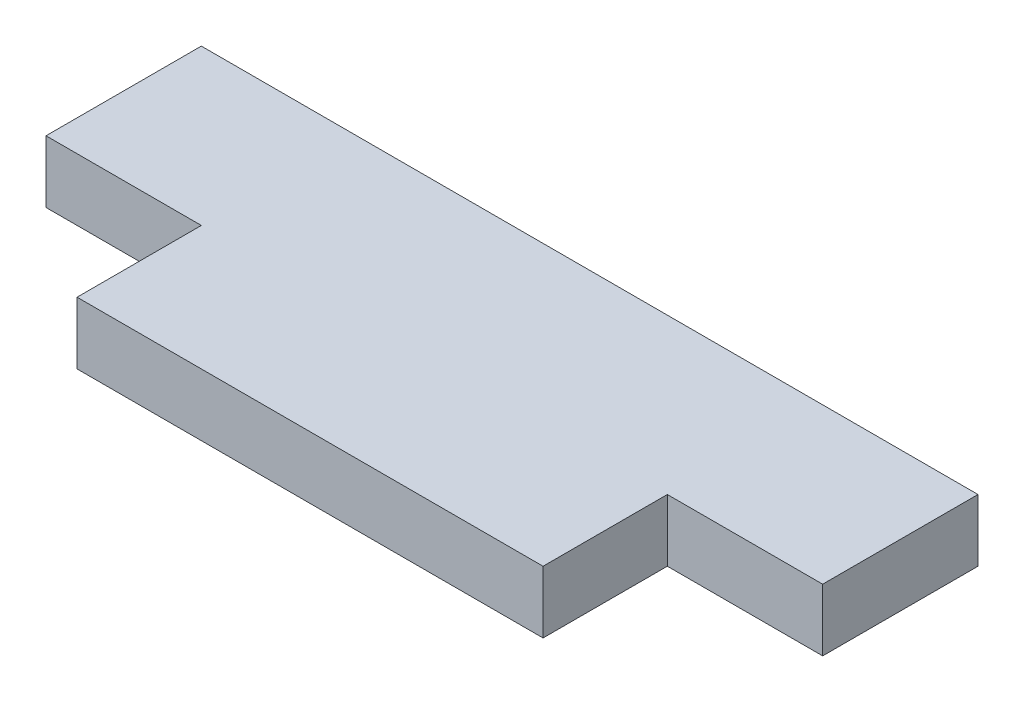
ISO-10303-21;
HEADER;
FILE_DESCRIPTION(('STEP AP214'),'2;1');
FILE_NAME('part.step','',(''),(''),'','','');
FILE_SCHEMA(('AUTOMOTIVE_DESIGN { 1 0 10303 214 1 1 1 1 }'));
ENDSEC;
DATA;
#1=APPLICATION_CONTEXT('core data for automotive mechanical design processes');
#2=APPLICATION_PROTOCOL_DEFINITION('international standard','automotive_design',2000,#1);
#3=PRODUCT_CONTEXT('',#1,'mechanical');
#4=PRODUCT('Part','Part','',(#3));
#5=PRODUCT_RELATED_PRODUCT_CATEGORY('part','',(#4));
#6=PRODUCT_DEFINITION_FORMATION('','',#4);
#7=PRODUCT_DEFINITION_CONTEXT('part definition',#1,'design');
#8=PRODUCT_DEFINITION('design','',#6,#7);
#9=PRODUCT_DEFINITION_SHAPE('','',#8);
#10=(LENGTH_UNIT() NAMED_UNIT(*) SI_UNIT(.MILLI.,.METRE.));
#11=(NAMED_UNIT(*) PLANE_ANGLE_UNIT() SI_UNIT($,.RADIAN.));
#12=(NAMED_UNIT(*) SI_UNIT($,.STERADIAN.) SOLID_ANGLE_UNIT());
#13=UNCERTAINTY_MEASURE_WITH_UNIT(LENGTH_MEASURE(1.E-05),#10,'distance_accuracy_value','');
#14=(GEOMETRIC_REPRESENTATION_CONTEXT(3) GLOBAL_UNCERTAINTY_ASSIGNED_CONTEXT((#13)) GLOBAL_UNIT_ASSIGNED_CONTEXT((#10,
#11,#12)) REPRESENTATION_CONTEXT('',''));
#15=CARTESIAN_POINT('',(0.,0.,0.));
#16=DIRECTION('',(0.,0.,1.));
#17=DIRECTION('',(1.,0.,0.));
#18=AXIS2_PLACEMENT_3D('',#15,#16,#17);
#19=CARTESIAN_POINT('',(-7.5,1.,4.));
#20=DIRECTION('',(1.,0.,0.));
#21=DIRECTION('',(0.,0.,-1.));
#22=AXIS2_PLACEMENT_3D('',#19,#20,#21);
#23=PLANE('',#22);
#24=DIRECTION('',(0.,-1.,0.));
#25=VECTOR('',#24,1.);
#26=CARTESIAN_POINT('',(-7.5,1.,0.));
#27=LINE('',#26,#25);
#28=CARTESIAN_POINT('',(-7.5,0.999999999999999,0.));
#29=VERTEX_POINT('',#28);
#30=CARTESIAN_POINT('',(-7.5,-1.,0.));
#31=VERTEX_POINT('',#30);
#32=EDGE_CURVE('E122',#29,#31,#27,.T.);
#33=ORIENTED_EDGE('',*,*,#32,.T.);
#34=DIRECTION('',(0.,0.,-1.));
#35=VECTOR('',#34,1.);
#36=CARTESIAN_POINT('',(-7.5,-1.,4.));
#37=LINE('',#36,#35);
#38=CARTESIAN_POINT('',(-7.5,-1.,4.));
#39=VERTEX_POINT('',#38);
#40=EDGE_CURVE('E11',#39,#31,#37,.T.);
#41=ORIENTED_EDGE('',*,*,#40,.F.);
#42=DIRECTION('',(0.,-1.,0.));
#43=VECTOR('',#42,1.);
#44=CARTESIAN_POINT('',(-7.5,1.,4.));
#45=LINE('',#44,#43);
#46=CARTESIAN_POINT('',(-7.5,1.,4.));
#47=VERTEX_POINT('',#46);
#48=EDGE_CURVE('E131',#47,#39,#45,.T.);
#49=ORIENTED_EDGE('',*,*,#48,.F.);
#50=DIRECTION('',(0.,0.,-1.));
#51=VECTOR('',#50,1.);
#52=CARTESIAN_POINT('',(-7.5,1.,4.));
#53=LINE('',#52,#51);
#54=EDGE_CURVE('E137',#47,#29,#53,.T.);
#55=ORIENTED_EDGE('',*,*,#54,.T.);
#56=EDGE_LOOP('',(#33,#41,#49,#55));
#57=FACE_BOUND('',#56,.T.);
#58=ADVANCED_FACE('F35',(#57),#23,.F.);
#59=CARTESIAN_POINT('',(-7.5,-1.,4.));
#60=DIRECTION('',(0.,1.,0.));
#61=DIRECTION('',(-1.,0.,0.));
#62=AXIS2_PLACEMENT_3D('',#59,#60,#61);
#63=PLANE('',#62);
#64=ORIENTED_EDGE('',*,*,#40,.T.);
#65=DIRECTION('',(-1.,0.,0.));
#66=VECTOR('',#65,1.);
#67=CARTESIAN_POINT('',(-12.5,-1.,0.));
#68=LINE('',#67,#66);
#69=CARTESIAN_POINT('',(-12.5,-1.,0.));
#70=VERTEX_POINT('',#69);
#71=EDGE_CURVE('E158',#31,#70,#68,.T.);
#72=ORIENTED_EDGE('',*,*,#71,.T.);
#73=DIRECTION('',(0.,0.,1.));
#74=VECTOR('',#73,1.);
#75=CARTESIAN_POINT('',(-12.5,-1.,-5.));
#76=LINE('',#75,#74);
#77=CARTESIAN_POINT('',(-12.5,-1.,-5.));
#78=VERTEX_POINT('',#77);
#79=EDGE_CURVE('E164',#78,#70,#76,.T.);
#80=ORIENTED_EDGE('',*,*,#79,.F.);
#81=DIRECTION('',(-1.,0.,0.));
#82=VECTOR('',#81,1.);
#83=CARTESIAN_POINT('',(-12.5,-1.,-5.));
#84=LINE('',#83,#82);
#85=CARTESIAN_POINT('',(12.5,-1.,-5.));
#86=VERTEX_POINT('',#85);
#87=EDGE_CURVE('E113',#86,#78,#84,.T.);
#88=ORIENTED_EDGE('',*,*,#87,.F.);
#89=DIRECTION('',(0.,0.,1.));
#90=VECTOR('',#89,1.);
#91=CARTESIAN_POINT('',(12.5,-1.,-5.));
#92=LINE('',#91,#90);
#93=CARTESIAN_POINT('',(12.5,-1.,0.));
#94=VERTEX_POINT('',#93);
#95=EDGE_CURVE('E127',#86,#94,#92,.T.);
#96=ORIENTED_EDGE('',*,*,#95,.T.);
#97=CARTESIAN_POINT('',(7.5,-1.,0.));
#98=VERTEX_POINT('',#97);
#99=EDGE_CURVE('E117',#94,#98,#68,.T.);
#100=ORIENTED_EDGE('',*,*,#99,.T.);
#101=DIRECTION('',(0.,0.,-1.));
#102=VECTOR('',#101,1.);
#103=CARTESIAN_POINT('',(7.5,-1.,4.));
#104=LINE('',#103,#102);
#105=CARTESIAN_POINT('',(7.5,-1.,4.));
#106=VERTEX_POINT('',#105);
#107=EDGE_CURVE('E43',#106,#98,#104,.T.);
#108=ORIENTED_EDGE('',*,*,#107,.F.);
#109=DIRECTION('',(1.,0.,0.));
#110=VECTOR('',#109,1.);
#111=CARTESIAN_POINT('',(-7.5,-1.,4.));
#112=LINE('',#111,#110);
#113=EDGE_CURVE('E133',#39,#106,#112,.T.);
#114=ORIENTED_EDGE('',*,*,#113,.F.);
#115=EDGE_LOOP('',(#64,#72,#80,#88,#96,#100,#108,#114));
#116=FACE_BOUND('',#115,.T.);
#117=ADVANCED_FACE('F152',(#116),#63,.F.);
#118=CARTESIAN_POINT('',(7.5,1.,4.));
#119=DIRECTION('',(-1.,0.,0.));
#120=DIRECTION('',(0.,0.,1.));
#121=AXIS2_PLACEMENT_3D('',#118,#119,#120);
#122=PLANE('',#121);
#123=DIRECTION('',(0.,1.,0.));
#124=VECTOR('',#123,1.);
#125=CARTESIAN_POINT('',(7.5,1.,0.));
#126=LINE('',#125,#124);
#127=CARTESIAN_POINT('',(7.5,1.,0.));
#128=VERTEX_POINT('',#127);
#129=EDGE_CURVE('E125',#98,#128,#126,.T.);
#130=ORIENTED_EDGE('',*,*,#129,.T.);
#131=DIRECTION('',(0.,0.,-1.));
#132=VECTOR('',#131,1.);
#133=CARTESIAN_POINT('',(7.5,1.,4.));
#134=LINE('',#133,#132);
#135=CARTESIAN_POINT('',(7.5,1.,4.));
#136=VERTEX_POINT('',#135);
#137=EDGE_CURVE('E143',#136,#128,#134,.T.);
#138=ORIENTED_EDGE('',*,*,#137,.F.);
#139=DIRECTION('',(0.,1.,0.));
#140=VECTOR('',#139,1.);
#141=CARTESIAN_POINT('',(7.5,1.,4.));
#142=LINE('',#141,#140);
#143=EDGE_CURVE('E135',#106,#136,#142,.T.);
#144=ORIENTED_EDGE('',*,*,#143,.F.);
#145=ORIENTED_EDGE('',*,*,#107,.T.);
#146=EDGE_LOOP('',(#130,#138,#144,#145));
#147=FACE_BOUND('',#146,.T.);
#148=ADVANCED_FACE('F148',(#147),#122,.F.);
#149=CARTESIAN_POINT('',(-7.5,1.,4.));
#150=DIRECTION('',(0.,-1.,0.));
#151=DIRECTION('',(1.,0.,0.));
#152=AXIS2_PLACEMENT_3D('',#149,#150,#151);
#153=PLANE('',#152);
#154=ORIENTED_EDGE('',*,*,#137,.T.);
#155=DIRECTION('',(1.,0.,0.));
#156=VECTOR('',#155,1.);
#157=CARTESIAN_POINT('',(-12.5,0.999999999999999,0.));
#158=LINE('',#157,#156);
#159=CARTESIAN_POINT('',(12.5,0.999999999999996,0.));
#160=VERTEX_POINT('',#159);
#161=EDGE_CURVE('E168',#128,#160,#158,.T.);
#162=ORIENTED_EDGE('',*,*,#161,.T.);
#163=DIRECTION('',(0.,0.,1.));
#164=VECTOR('',#163,1.);
#165=CARTESIAN_POINT('',(12.5,0.999999999999996,-5.));
#166=LINE('',#165,#164);
#167=CARTESIAN_POINT('',(12.5,0.999999999999996,-5.));
#168=VERTEX_POINT('',#167);
#169=EDGE_CURVE('E104',#168,#160,#166,.T.);
#170=ORIENTED_EDGE('',*,*,#169,.F.);
#171=DIRECTION('',(1.,0.,0.));
#172=VECTOR('',#171,1.);
#173=CARTESIAN_POINT('',(-12.5,0.999999999999999,-5.));
#174=LINE('',#173,#172);
#175=CARTESIAN_POINT('',(-12.5,0.999999999999999,-5.));
#176=VERTEX_POINT('',#175);
#177=EDGE_CURVE('E95',#176,#168,#174,.T.);
#178=ORIENTED_EDGE('',*,*,#177,.F.);
#179=DIRECTION('',(0.,0.,1.));
#180=VECTOR('',#179,1.);
#181=CARTESIAN_POINT('',(-12.5,0.999999999999999,-5.));
#182=LINE('',#181,#180);
#183=CARTESIAN_POINT('',(-12.5,0.999999999999999,0.));
#184=VERTEX_POINT('',#183);
#185=EDGE_CURVE('E101',#176,#184,#182,.T.);
#186=ORIENTED_EDGE('',*,*,#185,.T.);
#187=EDGE_CURVE('E169',#184,#29,#158,.T.);
#188=ORIENTED_EDGE('',*,*,#187,.T.);
#189=ORIENTED_EDGE('',*,*,#54,.F.);
#190=DIRECTION('',(-1.,0.,0.));
#191=VECTOR('',#190,1.);
#192=CARTESIAN_POINT('',(-7.5,1.,4.));
#193=LINE('',#192,#191);
#194=EDGE_CURVE('E50',#136,#47,#193,.T.);
#195=ORIENTED_EDGE('',*,*,#194,.F.);
#196=EDGE_LOOP('',(#154,#162,#170,#178,#186,#188,#189,#195));
#197=FACE_BOUND('',#196,.T.);
#198=ADVANCED_FACE('F98',(#197),#153,.F.);
#199=CARTESIAN_POINT('',(0.,0.,4.));
#200=DIRECTION('',(0.,0.,1.));
#201=DIRECTION('',(1.,0.,0.));
#202=AXIS2_PLACEMENT_3D('',#199,#200,#201);
#203=PLANE('',#202);
#204=ORIENTED_EDGE('',*,*,#48,.T.);
#205=ORIENTED_EDGE('',*,*,#113,.T.);
#206=ORIENTED_EDGE('',*,*,#143,.T.);
#207=ORIENTED_EDGE('',*,*,#194,.T.);
#208=EDGE_LOOP('',(#204,#205,#206,#207));
#209=FACE_BOUND('',#208,.T.);
#210=ADVANCED_FACE('F182',(#209),#203,.T.);
#211=CARTESIAN_POINT('',(0.,0.,0.));
#212=DIRECTION('',(0.,0.,1.));
#213=DIRECTION('',(1.,0.,0.));
#214=AXIS2_PLACEMENT_3D('',#211,#212,#213);
#215=PLANE('',#214);
#216=ORIENTED_EDGE('',*,*,#32,.F.);
#217=ORIENTED_EDGE('',*,*,#187,.F.);
#218=DIRECTION('',(0.,1.,0.));
#219=VECTOR('',#218,1.);
#220=CARTESIAN_POINT('',(-12.5,0.999999999999999,0.));
#221=LINE('',#220,#219);
#222=EDGE_CURVE('E121',#70,#184,#221,.T.);
#223=ORIENTED_EDGE('',*,*,#222,.F.);
#224=ORIENTED_EDGE('',*,*,#71,.F.);
#225=EDGE_LOOP('',(#216,#217,#223,#224));
#226=FACE_BOUND('',#225,.T.);
#227=ADVANCED_FACE('F175',(#226),#215,.T.);
#228=ORIENTED_EDGE('',*,*,#129,.F.);
#229=ORIENTED_EDGE('',*,*,#99,.F.);
#230=DIRECTION('',(0.,-1.,0.));
#231=VECTOR('',#230,1.);
#232=CARTESIAN_POINT('',(12.5,0.999999999999996,0.));
#233=LINE('',#232,#231);
#234=EDGE_CURVE('E160',#160,#94,#233,.T.);
#235=ORIENTED_EDGE('',*,*,#234,.F.);
#236=ORIENTED_EDGE('',*,*,#161,.F.);
#237=EDGE_LOOP('',(#228,#229,#235,#236));
#238=FACE_BOUND('',#237,.T.);
#239=ADVANCED_FACE('F173',(#238),#215,.T.);
#240=CARTESIAN_POINT('',(-12.5,0.999999999999999,-5.));
#241=DIRECTION('',(1.,0.,0.));
#242=DIRECTION('',(0.,1.,0.));
#243=AXIS2_PLACEMENT_3D('',#240,#241,#242);
#244=PLANE('',#243);
#245=ORIENTED_EDGE('',*,*,#222,.T.);
#246=ORIENTED_EDGE('',*,*,#185,.F.);
#247=DIRECTION('',(0.,1.,0.));
#248=VECTOR('',#247,1.);
#249=CARTESIAN_POINT('',(-12.5,0.999999999999999,-5.));
#250=LINE('',#249,#248);
#251=EDGE_CURVE('E108',#78,#176,#250,.T.);
#252=ORIENTED_EDGE('',*,*,#251,.F.);
#253=ORIENTED_EDGE('',*,*,#79,.T.);
#254=EDGE_LOOP('',(#245,#246,#252,#253));
#255=FACE_BOUND('',#254,.T.);
#256=ADVANCED_FACE('F119',(#255),#244,.F.);
#257=CARTESIAN_POINT('',(12.5,0.999999999999996,-5.));
#258=DIRECTION('',(-1.,0.,0.));
#259=DIRECTION('',(0.,0.,1.));
#260=AXIS2_PLACEMENT_3D('',#257,#258,#259);
#261=PLANE('',#260);
#262=ORIENTED_EDGE('',*,*,#234,.T.);
#263=ORIENTED_EDGE('',*,*,#95,.F.);
#264=DIRECTION('',(0.,-1.,0.));
#265=VECTOR('',#264,1.);
#266=CARTESIAN_POINT('',(12.5,0.999999999999996,-5.));
#267=LINE('',#266,#265);
#268=EDGE_CURVE('E107',#168,#86,#267,.T.);
#269=ORIENTED_EDGE('',*,*,#268,.F.);
#270=ORIENTED_EDGE('',*,*,#169,.T.);
#271=EDGE_LOOP('',(#262,#263,#269,#270));
#272=FACE_BOUND('',#271,.T.);
#273=ADVANCED_FACE('F172',(#272),#261,.F.);
#274=CARTESIAN_POINT('',(0.,0.,-5.));
#275=DIRECTION('',(0.,0.,1.));
#276=DIRECTION('',(1.,0.,0.));
#277=AXIS2_PLACEMENT_3D('',#274,#275,#276);
#278=PLANE('',#277);
#279=ORIENTED_EDGE('',*,*,#251,.T.);
#280=ORIENTED_EDGE('',*,*,#177,.T.);
#281=ORIENTED_EDGE('',*,*,#268,.T.);
#282=ORIENTED_EDGE('',*,*,#87,.T.);
#283=EDGE_LOOP('',(#279,#280,#281,#282));
#284=FACE_BOUND('',#283,.T.);
#285=ADVANCED_FACE('F111',(#284),#278,.F.);
#286=CLOSED_SHELL('',(#58,#117,#148,#198,#210,#227,#239,#256,#273,#285));
#287=MANIFOLD_SOLID_BREP('B2',#286);
#288=ADVANCED_BREP_SHAPE_REPRESENTATION('',(#18,#287),#14);
#289=SHAPE_DEFINITION_REPRESENTATION(#9,#288);
ENDSEC;
END-ISO-10303-21;
